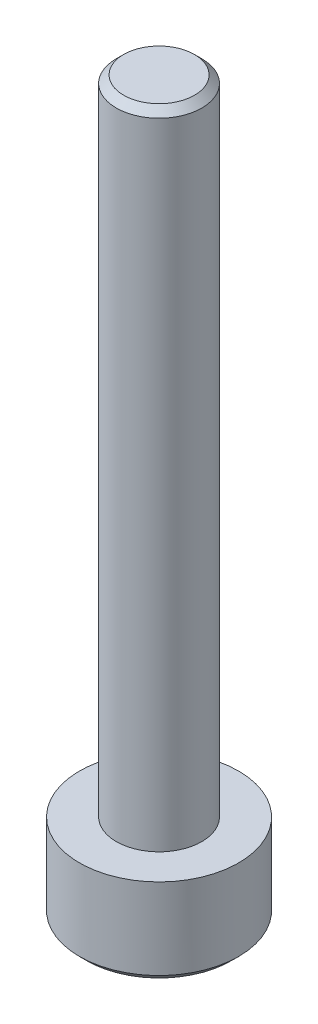
ISO-10303-21;
HEADER;
FILE_DESCRIPTION(('STEP AP214'),'2;1');
FILE_NAME('part.step','',(''),(''),'','','');
FILE_SCHEMA(('AUTOMOTIVE_DESIGN { 1 0 10303 214 1 1 1 1 }'));
ENDSEC;
DATA;
#1=APPLICATION_CONTEXT('core data for automotive mechanical design processes');
#2=APPLICATION_PROTOCOL_DEFINITION('international standard','automotive_design',2000,#1);
#3=PRODUCT_CONTEXT('',#1,'mechanical');
#4=PRODUCT('Part','Part','',(#3));
#5=PRODUCT_RELATED_PRODUCT_CATEGORY('part','',(#4));
#6=PRODUCT_DEFINITION_FORMATION('','',#4);
#7=PRODUCT_DEFINITION_CONTEXT('part definition',#1,'design');
#8=PRODUCT_DEFINITION('design','',#6,#7);
#9=PRODUCT_DEFINITION_SHAPE('','',#8);
#10=(LENGTH_UNIT() NAMED_UNIT(*) SI_UNIT(.MILLI.,.METRE.));
#11=(NAMED_UNIT(*) PLANE_ANGLE_UNIT() SI_UNIT($,.RADIAN.));
#12=(NAMED_UNIT(*) SI_UNIT($,.STERADIAN.) SOLID_ANGLE_UNIT());
#13=UNCERTAINTY_MEASURE_WITH_UNIT(LENGTH_MEASURE(1.E-05),#10,'distance_accuracy_value','');
#14=(GEOMETRIC_REPRESENTATION_CONTEXT(3) GLOBAL_UNCERTAINTY_ASSIGNED_CONTEXT((#13)) GLOBAL_UNIT_ASSIGNED_CONTEXT((#10,
#11,#12)) REPRESENTATION_CONTEXT('',''));
#15=CARTESIAN_POINT('',(0.,0.,0.));
#16=DIRECTION('',(0.,0.,1.));
#17=DIRECTION('',(1.,0.,0.));
#18=AXIS2_PLACEMENT_3D('',#15,#16,#17);
#19=CARTESIAN_POINT('',(-15.5228000000053,-18.3500000000003,36.5660001071556));
#20=DIRECTION('',(0.,1.,0.));
#21=DIRECTION('',(0.,0.,1.));
#22=AXIS2_PLACEMENT_3D('',#19,#20,#21);
#23=PLANE('',#22);
#24=CARTESIAN_POINT('',(-15.5228000000053,-18.3499999999642,36.5660001071556));
#25=DIRECTION('',(0.,-1.,0.));
#26=DIRECTION('',(0.,0.,-1.));
#27=AXIS2_PLACEMENT_3D('',#24,#25,#26);
#28=CIRCLE('',#27,1.24999999998276);
#29=CARTESIAN_POINT('',(-16.147800000001,-18.3499999999822,37.6485318618787));
#30=VERTEX_POINT('',#29);
#31=CARTESIAN_POINT('',(-14.8978000000096,-18.3499999999822,37.6485318618787));
#32=VERTEX_POINT('',#31);
#33=EDGE_CURVE('E285',#30,#32,#28,.F.);
#34=ORIENTED_EDGE('',*,*,#33,.T.);
#35=DIRECTION('',(0.866025403784438,0.,-0.5));
#36=VECTOR('',#35,1.);
#37=CARTESIAN_POINT('',(-15.5228000000053,-18.3500000000003,38.0093757801296));
#38=LINE('',#37,#36);
#39=CARTESIAN_POINT('',(-15.5228000000053,-18.3500000000003,38.0093757801296));
#40=VERTEX_POINT('',#39);
#41=EDGE_CURVE('E190',#32,#40,#38,.F.);
#42=ORIENTED_EDGE('',*,*,#41,.T.);
#43=DIRECTION('',(0.866025403784438,0.,0.5));
#44=VECTOR('',#43,1.);
#45=CARTESIAN_POINT('',(-16.7728000000053,-18.3500000000003,37.2876879436426));
#46=LINE('',#45,#44);
#47=EDGE_CURVE('E179',#40,#30,#46,.F.);
#48=ORIENTED_EDGE('',*,*,#47,.T.);
#49=EDGE_LOOP('',(#34,#42,#48));
#50=FACE_BOUND('',#49,.T.);
#51=ADVANCED_FACE('F16',(#50),#23,.F.);
#52=CARTESIAN_POINT('',(-15.5228000000053,-18.3500000000003,36.5660001071556));
#53=DIRECTION('',(0.,1.,0.));
#54=DIRECTION('',(0.,0.,1.));
#55=AXIS2_PLACEMENT_3D('',#52,#53,#54);
#56=PLANE('',#55);
#57=DIRECTION('',(0.,0.,-1.));
#58=VECTOR('',#57,1.);
#59=CARTESIAN_POINT('',(-14.2728000000053,-18.3500000000003,37.2876879436426));
#60=LINE('',#59,#58);
#61=CARTESIAN_POINT('',(-14.2728000000139,-18.3499999999822,36.5660001071556));
#62=VERTEX_POINT('',#61);
#63=CARTESIAN_POINT('',(-14.2728000000053,-18.3500000000003,37.2876879436426));
#64=VERTEX_POINT('',#63);
#65=EDGE_CURVE('E86',#62,#64,#60,.F.);
#66=ORIENTED_EDGE('',*,*,#65,.T.);
#67=DIRECTION('',(0.866025403784438,0.,-0.5));
#68=VECTOR('',#67,1.);
#69=CARTESIAN_POINT('',(-15.5228000000053,-18.3500000000003,38.0093757801296));
#70=LINE('',#69,#68);
#71=EDGE_CURVE('E188',#64,#32,#70,.F.);
#72=ORIENTED_EDGE('',*,*,#71,.T.);
#73=CARTESIAN_POINT('',(-15.5228000000053,-18.3499999999642,36.5660001071556));
#74=DIRECTION('',(0.,-1.,0.));
#75=DIRECTION('',(0.,0.,-1.));
#76=AXIS2_PLACEMENT_3D('',#73,#74,#75);
#77=CIRCLE('',#76,1.24999999998276);
#78=EDGE_CURVE('E287',#32,#62,#77,.F.);
#79=ORIENTED_EDGE('',*,*,#78,.T.);
#80=EDGE_LOOP('',(#66,#72,#79));
#81=FACE_BOUND('',#80,.T.);
#82=ADVANCED_FACE('F295',(#81),#56,.F.);
#83=CARTESIAN_POINT('',(-15.5228000000053,-20.2500000000003,38.0093757801296));
#84=DIRECTION('',(0.5,0.,0.866025403784438));
#85=DIRECTION('',(0.866025403784438,0.,-0.5));
#86=AXIS2_PLACEMENT_3D('',#83,#84,#85);
#87=PLANE('',#86);
#88=CARTESIAN_POINT('',(-15.5227999999972,-20.193375672993,38.0093757801249));
#89=CARTESIAN_POINT('',(-15.4801175563752,-20.1687559461718,37.9847330598101));
#90=CARTESIAN_POINT('',(-15.4367260098119,-20.1455737686743,37.9596809387212));
#91=CARTESIAN_POINT('',(-15.3482297913351,-20.1030803690877,37.9085876231614));
#92=CARTESIAN_POINT('',(-15.3031159179826,-20.0837949237996,37.8825411162371));
#93=CARTESIAN_POINT('',(-15.2115843030825,-20.0504931047224,37.8296953137352));
#94=CARTESIAN_POINT('',(-15.1651715602253,-20.0364588987216,37.8028989041527));
#95=CARTESIAN_POINT('',(-15.0713286285284,-20.0148526318887,37.748718662276));
#96=CARTESIAN_POINT('',(-15.0239020572991,-20.0072605878351,37.72133691861));
#97=CARTESIAN_POINT('',(-14.9632188888939,-20.0021889660016,37.686301474996));
#98=CARTESIAN_POINT('',(-14.9501416722315,-20.0013690434408,37.6787513404357));
#99=CARTESIAN_POINT('',(-14.9239769145469,-20.000274461217,37.6636451105432));
#100=CARTESIAN_POINT('',(-14.9108893830032,-19.9999995053513,37.6560890206834));
#101=CARTESIAN_POINT('',(-14.8649482213952,-20.000001241554,37.6295648786622));
#102=CARTESIAN_POINT('',(-14.8320847802657,-20.0017375772482,37.6105911620796));
#103=CARTESIAN_POINT('',(-14.7666142149239,-20.0085797997671,37.5727917135555));
#104=CARTESIAN_POINT('',(-14.7340072855495,-20.0136880367729,37.5539660941037));
#105=CARTESIAN_POINT('',(-14.6366210568422,-20.0337512506109,37.4977401287442));
#106=CARTESIAN_POINT('',(-14.5725515012742,-20.0534413272366,37.4607495535902));
#107=CARTESIAN_POINT('',(-14.4690579695075,-20.0937221523114,37.4009975351653));
#108=CARTESIAN_POINT('',(-14.4287908582222,-20.1116336746869,37.3777493076252));
#109=CARTESIAN_POINT('',(-14.3497813310795,-20.1504537227757,37.3321331358608));
#110=CARTESIAN_POINT('',(-14.311028338268,-20.1713333378975,37.3097590850292));
#111=CARTESIAN_POINT('',(-14.2728000000134,-20.1933756729931,37.2876879436472));
#112=B_SPLINE_CURVE_WITH_KNOTS('',3,(#88,#89,#90,#91,#92,#93,#94,#95,#96,#97,#98,#99,#100,#101,
#102,#103,#104,#105,#106,#107,#108,#109,#110,#111),.UNSPECIFIED.,.F.,.F.,(4,2,2,2,2,2,2,2,2,2,2,
4),(0.,0.165391499317371,0.331843613074453,0.497725243643207,0.663090417925458,
0.708451144395426,0.753787209426764,0.867571821864671,0.981435824887579,1.21010447291918,
1.35949058319742,1.50751033117175),.UNSPECIFIED.);
#113=CARTESIAN_POINT('',(-15.5228000000053,-20.193375672993,38.009375780125));
#114=VERTEX_POINT('',#113);
#115=CARTESIAN_POINT('',(-14.2728000000093,-20.1933756729954,37.2876879436449));
#116=VERTEX_POINT('',#115);
#117=EDGE_CURVE('E19',#114,#116,#112,.T.);
#118=ORIENTED_EDGE('',*,*,#117,.F.);
#119=DIRECTION('',(0.,1.,0.));
#120=VECTOR('',#119,1.);
#121=CARTESIAN_POINT('',(-15.5228000000053,-20.2500000000003,38.0093757801296));
#122=LINE('',#121,#120);
#123=EDGE_CURVE('E182',#114,#40,#122,.T.);
#124=ORIENTED_EDGE('',*,*,#123,.T.);
#125=ORIENTED_EDGE('',*,*,#41,.F.);
#126=ORIENTED_EDGE('',*,*,#71,.F.);
#127=DIRECTION('',(0.,1.,0.));
#128=VECTOR('',#127,1.);
#129=CARTESIAN_POINT('',(-14.2728000000053,-20.2500000000003,37.2876879436426));
#130=LINE('',#129,#128);
#131=EDGE_CURVE('E157',#64,#116,#130,.F.);
#132=ORIENTED_EDGE('',*,*,#131,.T.);
#133=EDGE_LOOP('',(#118,#124,#125,#126,#132));
#134=FACE_BOUND('',#133,.T.);
#135=ADVANCED_FACE('F275',(#134),#87,.F.);
#136=CARTESIAN_POINT('',(-16.7728000000053,-20.2500000000003,37.2876879436426));
#137=DIRECTION('',(-0.5,0.,0.866025403784438));
#138=DIRECTION('',(0.866025403784438,0.,0.5));
#139=AXIS2_PLACEMENT_3D('',#136,#137,#138);
#140=PLANE('',#139);
#141=ORIENTED_EDGE('',*,*,#123,.F.);
#142=CARTESIAN_POINT('',(-16.7727999999972,-20.1933756729931,37.2876879436473));
#143=CARTESIAN_POINT('',(-16.7301175563751,-20.1687559461718,37.3123306639622));
#144=CARTESIAN_POINT('',(-16.6867260098118,-20.1455737686743,37.337382785051));
#145=CARTESIAN_POINT('',(-16.5982297913351,-20.1030803690877,37.3884761006108));
#146=CARTESIAN_POINT('',(-16.5531159179826,-20.0837949237996,37.4145226075351));
#147=CARTESIAN_POINT('',(-16.4615843030825,-20.0504931047225,37.467368410037));
#148=CARTESIAN_POINT('',(-16.4151715602252,-20.0364588987216,37.4941648196195));
#149=CARTESIAN_POINT('',(-16.3213286285283,-20.0148526318888,37.5483450614962));
#150=CARTESIAN_POINT('',(-16.273902057299,-20.0072605878352,37.5757268051622));
#151=CARTESIAN_POINT('',(-16.2132188888938,-20.0021889660017,37.6107622487762));
#152=CARTESIAN_POINT('',(-16.2001416722314,-20.0013690434408,37.6183123833365));
#153=CARTESIAN_POINT('',(-16.1739769145469,-20.000274461217,37.633418613229));
#154=CARTESIAN_POINT('',(-16.1608893830032,-19.9999995053513,37.6409747030888));
#155=CARTESIAN_POINT('',(-16.1149482213952,-20.000001241554,37.66749884511));
#156=CARTESIAN_POINT('',(-16.0820847802657,-20.0017375772483,37.6864725616926));
#157=CARTESIAN_POINT('',(-16.0166142149239,-20.0085797997671,37.7242720102167));
#158=CARTESIAN_POINT('',(-15.9840072855495,-20.0136880367729,37.7430976296685));
#159=CARTESIAN_POINT('',(-15.8866210568422,-20.0337512506109,37.799323595028));
#160=CARTESIAN_POINT('',(-15.8225515012742,-20.0534413272366,37.836314170182));
#161=CARTESIAN_POINT('',(-15.7190579695075,-20.0937221523114,37.8960661886069));
#162=CARTESIAN_POINT('',(-15.6787908582222,-20.1116336746869,37.919314416147));
#163=CARTESIAN_POINT('',(-15.5997813310795,-20.1504537227757,37.9649305879114));
#164=CARTESIAN_POINT('',(-15.561028338268,-20.1713333378975,37.987304638743));
#165=CARTESIAN_POINT('',(-15.5228000000134,-20.1933756729931,38.009375780125));
#166=B_SPLINE_CURVE_WITH_KNOTS('',3,(#142,#143,#144,#145,#146,#147,#148,#149,#150,#151,#152,
#153,#154,#155,#156,#157,#158,#159,#160,#161,#162,#163,#164,#165),.UNSPECIFIED.,.F.,.F.,(4,2,2,
2,2,2,2,2,2,2,2,4),(0.,0.165391499317376,0.331843613074476,0.497725243643234,0.663090417925483,
0.708451144395425,0.753787209426728,0.86757182186464,0.98143582488755,1.21010447291914,
1.35949058319738,1.50751033117172),.UNSPECIFIED.);
#167=CARTESIAN_POINT('',(-16.7728000000013,-20.1933756729931,37.2876879436403));
#168=VERTEX_POINT('',#167);
#169=EDGE_CURVE('E185',#168,#114,#166,.T.);
#170=ORIENTED_EDGE('',*,*,#169,.F.);
#171=DIRECTION('',(0.,1.,0.));
#172=VECTOR('',#171,1.);
#173=CARTESIAN_POINT('',(-16.7728000000053,-20.2500000000003,37.2876879436426));
#174=LINE('',#173,#172);
#175=CARTESIAN_POINT('',(-16.7728000000053,-18.3500000000003,37.2876879436426));
#176=VERTEX_POINT('',#175);
#177=EDGE_CURVE('E153',#168,#176,#174,.T.);
#178=ORIENTED_EDGE('',*,*,#177,.T.);
#179=DIRECTION('',(0.866025403784452,0.,0.499999999999977));
#180=VECTOR('',#179,1.);
#181=CARTESIAN_POINT('',(-16.7728000000053,-18.3500000000003,37.2876879436426));
#182=LINE('',#181,#180);
#183=EDGE_CURVE('E176',#176,#30,#182,.T.);
#184=ORIENTED_EDGE('',*,*,#183,.T.);
#185=ORIENTED_EDGE('',*,*,#47,.F.);
#186=EDGE_LOOP('',(#141,#170,#178,#184,#185));
#187=FACE_BOUND('',#186,.T.);
#188=ADVANCED_FACE('F271',(#187),#140,.F.);
#189=CARTESIAN_POINT('',(-15.5228000000053,-18.3500000000003,36.5660001071556));
#190=DIRECTION('',(0.,1.,0.));
#191=DIRECTION('',(0.,0.,1.));
#192=AXIS2_PLACEMENT_3D('',#189,#190,#191);
#193=PLANE('',#192);
#194=ORIENTED_EDGE('',*,*,#183,.F.);
#195=DIRECTION('',(0.,0.,1.));
#196=VECTOR('',#195,1.);
#197=CARTESIAN_POINT('',(-16.7728000000053,-18.3500000000003,35.8443122706685));
#198=LINE('',#197,#196);
#199=CARTESIAN_POINT('',(-16.7727999999967,-18.3499999999822,36.5660001071556));
#200=VERTEX_POINT('',#199);
#201=EDGE_CURVE('E150',#176,#200,#198,.F.);
#202=ORIENTED_EDGE('',*,*,#201,.T.);
#203=CARTESIAN_POINT('',(-15.5228000000053,-18.3499999999642,36.5660001071556));
#204=DIRECTION('',(0.,-1.,0.));
#205=DIRECTION('',(0.,0.,-1.));
#206=AXIS2_PLACEMENT_3D('',#203,#204,#205);
#207=CIRCLE('',#206,1.24999999998276);
#208=EDGE_CURVE('E116',#200,#30,#207,.F.);
#209=ORIENTED_EDGE('',*,*,#208,.T.);
#210=EDGE_LOOP('',(#194,#202,#209));
#211=FACE_BOUND('',#210,.T.);
#212=ADVANCED_FACE('F268',(#211),#193,.F.);
#213=CARTESIAN_POINT('',(-15.5228000000053,-18.3499999998276,36.5660001071556));
#214=DIRECTION('',(0.,-1.,0.));
#215=DIRECTION('',(0.,0.,-1.));
#216=AXIS2_PLACEMENT_3D('',#213,#214,#215);
#217=CONICAL_SURFACE('',#216,1.24999999975539,1.0297442584364);
#218=ORIENTED_EDGE('',*,*,#33,.F.);
#219=ORIENTED_EDGE('',*,*,#208,.F.);
#220=CARTESIAN_POINT('',(-15.5228000000053,-18.3499999999642,36.5660001071556));
#221=DIRECTION('',(0.,-1.,0.));
#222=DIRECTION('',(0.,0.,-1.));
#223=AXIS2_PLACEMENT_3D('',#220,#221,#222);
#224=CIRCLE('',#223,1.24999999998276);
#225=CARTESIAN_POINT('',(-16.147800000001,-18.3499999999822,35.4834683524325));
#226=VERTEX_POINT('',#225);
#227=EDGE_CURVE('E109',#200,#226,#224,.T.);
#228=ORIENTED_EDGE('',*,*,#227,.T.);
#229=CARTESIAN_POINT('',(-15.5228000000053,-18.3499999999642,36.5660001071556));
#230=DIRECTION('',(0.,-1.,0.));
#231=DIRECTION('',(0.,0.,-1.));
#232=AXIS2_PLACEMENT_3D('',#229,#230,#231);
#233=CIRCLE('',#232,1.24999999998276);
#234=CARTESIAN_POINT('',(-14.8978000000096,-18.3499999999822,35.4834683524325));
#235=VERTEX_POINT('',#234);
#236=EDGE_CURVE('E114',#226,#235,#233,.T.);
#237=ORIENTED_EDGE('',*,*,#236,.T.);
#238=CARTESIAN_POINT('',(-15.5228000000053,-18.3499999999642,36.5660001071556));
#239=DIRECTION('',(0.,-1.,0.));
#240=DIRECTION('',(0.,0.,-1.));
#241=AXIS2_PLACEMENT_3D('',#238,#239,#240);
#242=CIRCLE('',#241,1.24999999998276);
#243=EDGE_CURVE('E165',#235,#62,#242,.T.);
#244=ORIENTED_EDGE('',*,*,#243,.T.);
#245=ORIENTED_EDGE('',*,*,#78,.F.);
#246=EDGE_LOOP('',(#218,#219,#228,#237,#244,#245));
#247=FACE_BOUND('',#246,.T.);
#248=CARTESIAN_POINT('',(-15.5228000000053,-17.5989242259789,36.5660001068022));
#249=VERTEX_POINT('',#248);
#250=VERTEX_LOOP('',#249);
#251=FACE_BOUND('',#250,.T.);
#252=ADVANCED_FACE('F111',(#247,#251),#217,.F.);
#253=CARTESIAN_POINT('',(-15.5228000000053,-18.3500000000003,36.5660001071556));
#254=DIRECTION('',(0.,1.,0.));
#255=DIRECTION('',(0.,0.,1.));
#256=AXIS2_PLACEMENT_3D('',#253,#254,#255);
#257=PLANE('',#256);
#258=DIRECTION('',(-0.866025403784438,0.,-0.5));
#259=VECTOR('',#258,1.);
#260=CARTESIAN_POINT('',(-14.2728000000053,-18.3500000000003,35.8443122706685));
#261=LINE('',#260,#259);
#262=CARTESIAN_POINT('',(-14.2728000000053,-18.3500000000003,35.8443122706685));
#263=VERTEX_POINT('',#262);
#264=EDGE_CURVE('E168',#235,#263,#261,.F.);
#265=ORIENTED_EDGE('',*,*,#264,.T.);
#266=DIRECTION('',(0.,0.,-1.));
#267=VECTOR('',#266,1.);
#268=CARTESIAN_POINT('',(-14.2728000000053,-18.3500000000003,37.2876879436426));
#269=LINE('',#268,#267);
#270=EDGE_CURVE('E162',#263,#62,#269,.F.);
#271=ORIENTED_EDGE('',*,*,#270,.T.);
#272=ORIENTED_EDGE('',*,*,#243,.F.);
#273=EDGE_LOOP('',(#265,#271,#272));
#274=FACE_BOUND('',#273,.T.);
#275=ADVANCED_FACE('F260',(#274),#257,.F.);
#276=CARTESIAN_POINT('',(-14.2728000000053,-20.2500000000003,37.2876879436426));
#277=DIRECTION('',(1.,0.,0.));
#278=DIRECTION('',(0.,0.,-1.));
#279=AXIS2_PLACEMENT_3D('',#276,#277,#278);
#280=PLANE('',#279);
#281=CARTESIAN_POINT('',(-14.2728000000053,-20.1933756729931,37.2876879436333));
#282=CARTESIAN_POINT('',(-14.2728000000053,-20.1687559461718,37.2384025030035));
#283=CARTESIAN_POINT('',(-14.2728000000053,-20.1455737686743,37.1882982608258));
#284=CARTESIAN_POINT('',(-14.2728000000053,-20.1030803690877,37.0861116297061));
#285=CARTESIAN_POINT('',(-14.2728000000053,-20.0837949237996,37.0340186158577));
#286=CARTESIAN_POINT('',(-14.2728000000053,-20.0504931047225,36.9283270108537));
#287=CARTESIAN_POINT('',(-14.2728000000053,-20.0364588987216,36.8747341916889));
#288=CARTESIAN_POINT('',(-14.2728000000053,-20.0148526318888,36.7663737079354));
#289=CARTESIAN_POINT('',(-14.2728000000053,-20.0072605878352,36.7116102206034));
#290=CARTESIAN_POINT('',(-14.2728000000053,-20.0021889660017,36.6415393333754));
#291=CARTESIAN_POINT('',(-14.2728000000053,-20.0013690434408,36.6264390642548));
#292=CARTESIAN_POINT('',(-14.2728000000053,-20.000274461217,36.5962266044699));
#293=CARTESIAN_POINT('',(-14.2728000000053,-19.9999995053514,36.5811144247503));
#294=CARTESIAN_POINT('',(-14.2728000000053,-20.000001241554,36.5280661407078));
#295=CARTESIAN_POINT('',(-14.2728000000053,-20.0017375772483,36.4901187075426));
#296=CARTESIAN_POINT('',(-14.2728000000053,-20.0085797997672,36.4145198104944));
#297=CARTESIAN_POINT('',(-14.2728000000053,-20.013688036773,36.3768685715909));
#298=CARTESIAN_POINT('',(-14.2728000000053,-20.0337512506109,36.2644166408718));
#299=CARTESIAN_POINT('',(-14.2728000000053,-20.0534413272367,36.1904354905637));
#300=CARTESIAN_POINT('',(-14.2728000000053,-20.0937221523115,36.0709314537139));
#301=CARTESIAN_POINT('',(-14.2728000000053,-20.111633674687,36.0244349986339));
#302=CARTESIAN_POINT('',(-14.2728000000053,-20.1504537227757,35.933202655105));
#303=CARTESIAN_POINT('',(-14.2728000000053,-20.1713333378976,35.8884545534418));
#304=CARTESIAN_POINT('',(-14.2728000000053,-20.1933756729931,35.8443122706779));
#305=B_SPLINE_CURVE_WITH_KNOTS('',3,(#281,#282,#283,#284,#285,#286,#287,#288,#289,#290,#291,
#292,#293,#294,#295,#296,#297,#298,#299,#300,#301,#302,#303,#304),.UNSPECIFIED.,.F.,.F.,(4,2,2,
2,2,2,2,2,2,2,2,4),(0.,0.165391499317367,0.331843613074439,0.49772524364318,0.66309041792541,
0.708451144395361,0.753787209426684,0.867571821864597,0.981435824887513,1.21010447291912,
1.35949058319737,1.50751033117172),.UNSPECIFIED.);
#306=CARTESIAN_POINT('',(-14.2728000000053,-20.1933756729955,35.8443122706732));
#307=VERTEX_POINT('',#306);
#308=EDGE_CURVE('E80',#116,#307,#305,.T.);
#309=ORIENTED_EDGE('',*,*,#308,.F.);
#310=ORIENTED_EDGE('',*,*,#131,.F.);
#311=ORIENTED_EDGE('',*,*,#65,.F.);
#312=ORIENTED_EDGE('',*,*,#270,.F.);
#313=DIRECTION('',(0.,1.,0.));
#314=VECTOR('',#313,1.);
#315=CARTESIAN_POINT('',(-14.2728000000053,-20.2500000000003,35.8443122706685));
#316=LINE('',#315,#314);
#317=EDGE_CURVE('E170',#263,#307,#316,.F.);
#318=ORIENTED_EDGE('',*,*,#317,.T.);
#319=EDGE_LOOP('',(#309,#310,#311,#312,#318));
#320=FACE_BOUND('',#319,.T.);
#321=ADVANCED_FACE('F255',(#320),#280,.F.);
#322=CARTESIAN_POINT('',(-16.7728000000053,-20.2500000000003,35.8443122706685));
#323=DIRECTION('',(-1.,0.,0.));
#324=DIRECTION('',(0.,0.,1.));
#325=AXIS2_PLACEMENT_3D('',#322,#323,#324);
#326=PLANE('',#325);
#327=ORIENTED_EDGE('',*,*,#177,.F.);
#328=CARTESIAN_POINT('',(-16.7728000000053,-20.1933756715777,35.8443122735088));
#329=CARTESIAN_POINT('',(-16.7728000000053,-20.1687559449108,35.8935977139733));
#330=CARTESIAN_POINT('',(-16.7728000000053,-20.1455737675654,35.9437019559814));
#331=CARTESIAN_POINT('',(-16.7728000000053,-20.1030803682698,36.0458885867454));
#332=CARTESIAN_POINT('',(-16.7728000000053,-20.0837949231201,36.0979816004077));
#333=CARTESIAN_POINT('',(-16.7728000000053,-20.0504931042925,36.203673205023));
#334=CARTESIAN_POINT('',(-16.7728000000053,-20.0364588984027,36.2572660239855));
#335=CARTESIAN_POINT('',(-16.7728000000053,-20.0148526317471,36.3656265073211));
#336=CARTESIAN_POINT('',(-16.7728000000053,-20.0072605877601,36.4203899944376));
#337=CARTESIAN_POINT('',(-16.7728000000053,-20.002188965977,36.4904608813621));
#338=CARTESIAN_POINT('',(-16.7728000000053,-20.0013690434254,36.5055611503976));
#339=CARTESIAN_POINT('',(-16.7728000000053,-20.0002744612139,36.535773610012));
#340=CARTESIAN_POINT('',(-16.7728000000053,-19.9999995053514,36.5508857896463));
#341=CARTESIAN_POINT('',(-16.7728000000053,-20.000001241554,36.6039340736033));
#342=CARTESIAN_POINT('',(-16.7728000000053,-20.0017375772483,36.6418815067686));
#343=CARTESIAN_POINT('',(-16.7728000000053,-20.0085797997672,36.7174804038168));
#344=CARTESIAN_POINT('',(-16.7728000000053,-20.013688036773,36.7551316427204));
#345=CARTESIAN_POINT('',(-16.7728000000053,-20.033751250611,36.8675835734394));
#346=CARTESIAN_POINT('',(-16.7728000000053,-20.0534413272367,36.9415647237475));
#347=CARTESIAN_POINT('',(-16.7728000000053,-20.0937221523115,37.0610687605973));
#348=CARTESIAN_POINT('',(-16.7728000000053,-20.111633674687,37.1075652156773));
#349=CARTESIAN_POINT('',(-16.7728000000053,-20.1504537227757,37.1987975592061));
#350=CARTESIAN_POINT('',(-16.7728000000053,-20.1713333378976,37.2435456608693));
#351=CARTESIAN_POINT('',(-16.7728000000053,-20.1933756729931,37.2876879436333));
#352=B_SPLINE_CURVE_WITH_KNOTS('',3,(#328,#329,#330,#331,#332,#333,#334,#335,#336,#337,#338,
#339,#340,#341,#342,#343,#344,#345,#346,#347,#348,#349,#350,#351),.UNSPECIFIED.,.F.,.F.,(4,2,2,
2,2,2,2,2,2,2,2,4),(0.,0.165391498665354,0.331843611755447,0.497725241655209,0.663090415275238,
0.708451141488781,0.753787206264148,0.867571818702068,0.981435821725076,1.21010446975658,
1.35949058003477,1.50751032800909),.UNSPECIFIED.);
#353=CARTESIAN_POINT('',(-16.7728000000053,-20.1933756722877,35.8443122720887));
#354=VERTEX_POINT('',#353);
#355=EDGE_CURVE('E40',#354,#168,#352,.T.);
#356=ORIENTED_EDGE('',*,*,#355,.F.);
#357=DIRECTION('',(0.,1.,0.));
#358=VECTOR('',#357,1.);
#359=CARTESIAN_POINT('',(-16.7728000000053,-20.2500000000003,35.8443122706685));
#360=LINE('',#359,#358);
#361=CARTESIAN_POINT('',(-16.7728000000053,-18.3500000000003,35.8443122706685));
#362=VERTEX_POINT('',#361);
#363=EDGE_CURVE('E127',#354,#362,#360,.T.);
#364=ORIENTED_EDGE('',*,*,#363,.T.);
#365=DIRECTION('',(0.,0.,1.));
#366=VECTOR('',#365,1.);
#367=CARTESIAN_POINT('',(-16.7728000000053,-18.3500000000003,36.5660001071556));
#368=LINE('',#367,#366);
#369=EDGE_CURVE('E119',#362,#200,#368,.T.);
#370=ORIENTED_EDGE('',*,*,#369,.T.);
#371=ORIENTED_EDGE('',*,*,#201,.F.);
#372=EDGE_LOOP('',(#327,#356,#364,#370,#371));
#373=FACE_BOUND('',#372,.T.);
#374=ADVANCED_FACE('F259',(#373),#326,.F.);
#375=CARTESIAN_POINT('',(-15.5228000000053,-18.3500000000003,36.5660001071556));
#376=DIRECTION('',(0.,1.,0.));
#377=DIRECTION('',(0.,0.,1.));
#378=AXIS2_PLACEMENT_3D('',#375,#376,#377);
#379=PLANE('',#378);
#380=ORIENTED_EDGE('',*,*,#369,.F.);
#381=DIRECTION('',(-0.866025403784438,0.,0.5));
#382=VECTOR('',#381,1.);
#383=CARTESIAN_POINT('',(-15.5228000000053,-18.3500000000003,35.1226244341815));
#384=LINE('',#383,#382);
#385=EDGE_CURVE('E122',#362,#226,#384,.F.);
#386=ORIENTED_EDGE('',*,*,#385,.T.);
#387=ORIENTED_EDGE('',*,*,#227,.F.);
#388=EDGE_LOOP('',(#380,#386,#387));
#389=FACE_BOUND('',#388,.T.);
#390=ADVANCED_FACE('F123',(#389),#379,.F.);
#391=CARTESIAN_POINT('',(-15.5228000000053,-18.3500000000003,36.5660001071556));
#392=DIRECTION('',(0.,1.,0.));
#393=DIRECTION('',(0.,0.,1.));
#394=AXIS2_PLACEMENT_3D('',#391,#392,#393);
#395=PLANE('',#394);
#396=DIRECTION('',(-0.866025403784438,0.,0.5));
#397=VECTOR('',#396,1.);
#398=CARTESIAN_POINT('',(-15.5228000000053,-18.3500000000003,35.1226244341815));
#399=LINE('',#398,#397);
#400=CARTESIAN_POINT('',(-15.5228000000053,-18.3500000000003,35.1226244341815));
#401=VERTEX_POINT('',#400);
#402=EDGE_CURVE('E103',#226,#401,#399,.F.);
#403=ORIENTED_EDGE('',*,*,#402,.T.);
#404=DIRECTION('',(-0.866025403784438,0.,-0.5));
#405=VECTOR('',#404,1.);
#406=CARTESIAN_POINT('',(-14.2728000000053,-18.3500000000003,35.8443122706685));
#407=LINE('',#406,#405);
#408=EDGE_CURVE('E130',#401,#235,#407,.F.);
#409=ORIENTED_EDGE('',*,*,#408,.T.);
#410=ORIENTED_EDGE('',*,*,#236,.F.);
#411=EDGE_LOOP('',(#403,#409,#410));
#412=FACE_BOUND('',#411,.T.);
#413=ADVANCED_FACE('F129',(#412),#395,.F.);
#414=CARTESIAN_POINT('',(-14.2728000000053,-20.2500000000003,35.8443122706685));
#415=DIRECTION('',(0.5,0.,-0.866025403784438));
#416=DIRECTION('',(-0.866025403784438,0.,-0.5));
#417=AXIS2_PLACEMENT_3D('',#414,#415,#416);
#418=PLANE('',#417);
#419=CARTESIAN_POINT('',(-14.2728000000134,-20.1933756729931,35.8443122706638));
#420=CARTESIAN_POINT('',(-14.3154824436418,-20.1687559461682,35.8196695503453));
#421=CARTESIAN_POINT('',(-14.3588739902116,-20.1455737686675,35.7946174292527));
#422=CARTESIAN_POINT('',(-14.4473702087018,-20.1030803690759,35.7435241136851));
#423=CARTESIAN_POINT('',(-14.4924840820613,-20.0837949237859,35.7174776067568));
#424=CARTESIAN_POINT('',(-14.5840156969622,-20.0504931047118,35.6646318042544));
#425=CARTESIAN_POINT('',(-14.6304284398129,-20.0364588987144,35.6378353946757));
#426=CARTESIAN_POINT('',(-14.7242713714962,-20.0148526318866,35.5836551528068));
#427=CARTESIAN_POINT('',(-14.7716979427185,-20.0072605878347,35.5562734091449));
#428=CARTESIAN_POINT('',(-14.8323811111163,-20.0021889660018,35.5212379655351));
#429=CARTESIAN_POINT('',(-14.8454583277782,-20.0013690434409,35.5136878309751));
#430=CARTESIAN_POINT('',(-14.8716230854628,-20.0002744612171,35.4985816010826));
#431=CARTESIAN_POINT('',(-14.884710617007,-19.9999995053514,35.4910255112226));
#432=CARTESIAN_POINT('',(-14.9306517786204,-20.0000012415541,35.4645013691982));
#433=CARTESIAN_POINT('',(-14.9635152197549,-20.0017375772489,35.4455276526127));
#434=CARTESIAN_POINT('',(-15.0289857851066,-20.0085797997698,35.4077282040829));
#435=CARTESIAN_POINT('',(-15.0615927144858,-20.0136880367772,35.3889025846284));
#436=CARTESIAN_POINT('',(-15.1589789431884,-20.0337512506169,35.3326766192715));
#437=CARTESIAN_POINT('',(-15.2230484987484,-20.0534413272398,35.2956860441222));
#438=CARTESIAN_POINT('',(-15.3265420267389,-20.0937221508475,35.2359340278774));
#439=CARTESIAN_POINT('',(-15.3668091343736,-20.1116336713924,35.2126858024451));
#440=CARTESIAN_POINT('',(-15.445818654488,-20.1504537153395,35.1670696347385));
#441=CARTESIAN_POINT('',(-15.4845716439188,-20.1713333281575,35.1446955858587));
#442=CARTESIAN_POINT('',(-15.5227999788845,-20.1933756608037,35.1226244463756));
#443=B_SPLINE_CURVE_WITH_KNOTS('',3,(#419,#420,#421,#422,#423,#424,#425,#426,#427,#428,#429,
#430,#431,#432,#433,#434,#435,#436,#437,#438,#439,#440,#441,#442),.UNSPECIFIED.,.F.,.F.,(4,2,2,
2,2,2,2,2,2,2,2,4),(0.,0.165391499341779,0.331843613123341,0.497725243667557,0.663090417925434,
0.708451144393822,0.753787209426734,0.867571821881892,0.981435824922463,1.21010447291927,
1.35949056945268,1.50751030392988),.UNSPECIFIED.);
#444=CARTESIAN_POINT('',(-15.5228000000053,-20.1933756611936,35.1226244459857));
#445=VERTEX_POINT('',#444);
#446=EDGE_CURVE('E222',#307,#445,#443,.T.);
#447=ORIENTED_EDGE('',*,*,#446,.F.);
#448=ORIENTED_EDGE('',*,*,#317,.F.);
#449=ORIENTED_EDGE('',*,*,#264,.F.);
#450=ORIENTED_EDGE('',*,*,#408,.F.);
#451=DIRECTION('',(0.,1.,0.));
#452=VECTOR('',#451,1.);
#453=CARTESIAN_POINT('',(-15.5228000000053,-20.2500000000003,35.1226244341815));
#454=LINE('',#453,#452);
#455=EDGE_CURVE('E137',#401,#445,#454,.F.);
#456=ORIENTED_EDGE('',*,*,#455,.T.);
#457=EDGE_LOOP('',(#447,#448,#449,#450,#456));
#458=FACE_BOUND('',#457,.T.);
#459=ADVANCED_FACE('F355',(#458),#418,.F.);
#460=CARTESIAN_POINT('',(-15.5228000000053,-20.2500000000003,35.1226244341815));
#461=DIRECTION('',(-0.5,0.,-0.866025403784438));
#462=DIRECTION('',(-0.866025403784438,0.,0.5));
#463=AXIS2_PLACEMENT_3D('',#460,#461,#462);
#464=PLANE('',#463);
#465=CARTESIAN_POINT('',(-16.7728000122493,-20.1933756800651,35.8443122777351));
#466=CARTESIAN_POINT('',(-16.7301175679047,-20.1687559524691,35.8196695570047));
#467=CARTESIAN_POINT('',(-16.6867260206003,-20.1455737742087,35.7946174354886));
#468=CARTESIAN_POINT('',(-16.5982298005707,-20.1030803731634,35.7435241190327));
#469=CARTESIAN_POINT('',(-16.5531159264056,-20.0837949271812,35.7174776116391));
#470=CARTESIAN_POINT('',(-16.461584309823,-20.05049310686,35.6646318081657));
#471=CARTESIAN_POINT('',(-16.4151715660963,-20.0364589003079,35.6378353980813));
#472=CARTESIAN_POINT('',(-16.3213286326041,-20.0148526325945,35.5836551551681));
#473=CARTESIAN_POINT('',(-16.2739020604493,-20.00726058821,35.5562734109677));
#474=CARTESIAN_POINT('',(-16.2132188907382,-20.0021889661251,35.5212379665997));
#475=CARTESIAN_POINT('',(-16.200141673708,-20.0013690435181,35.5136878318271));
#476=CARTESIAN_POINT('',(-16.1739769152861,-20.0002744612326,35.4985816015089));
#477=CARTESIAN_POINT('',(-16.1608893833728,-19.9999995053514,35.4910255114358));
#478=CARTESIAN_POINT('',(-16.1149482213901,-20.0000012415541,35.4645013691982));
#479=CARTESIAN_POINT('',(-16.0820847802557,-20.0017375772488,35.4455276526127));
#480=CARTESIAN_POINT('',(-16.0166142149042,-20.0085797997698,35.4077282040831));
#481=CARTESIAN_POINT('',(-15.9840072855251,-20.0136880367772,35.3889025846286));
#482=CARTESIAN_POINT('',(-15.8866210568224,-20.0337512506168,35.3326766192717));
#483=CARTESIAN_POINT('',(-15.8225515012624,-20.0534413272397,35.2956860441223));
#484=CARTESIAN_POINT('',(-15.7190579732717,-20.0937221508475,35.2359340278775));
#485=CARTESIAN_POINT('',(-15.6787908656369,-20.1116336713923,35.2126858024451));
#486=CARTESIAN_POINT('',(-15.5997813455225,-20.1504537153395,35.1670696347385));
#487=CARTESIAN_POINT('',(-15.5610283560917,-20.1713333281575,35.1446955858587));
#488=CARTESIAN_POINT('',(-15.5228000211261,-20.1933756608037,35.1226244463756));
#489=B_SPLINE_CURVE_WITH_KNOTS('',3,(#465,#466,#467,#468,#469,#470,#471,#472,#473,#474,#475,
#476,#477,#478,#479,#480,#481,#482,#483,#484,#485,#486,#487,#488),.UNSPECIFIED.,.F.,.F.,(4,2,2,
2,2,2,2,2,2,2,2,4),(0.,0.165391502600136,0.331843619714929,0.497725253602437,0.663090431169706,
0.708451158918775,0.75378722523015,0.867571837685272,0.981435840725377,1.21010448872267,
1.35949058525618,1.50751031973331),.UNSPECIFIED.);
#490=EDGE_CURVE('E139',#354,#445,#489,.T.);
#491=ORIENTED_EDGE('',*,*,#490,.T.);
#492=ORIENTED_EDGE('',*,*,#455,.F.);
#493=ORIENTED_EDGE('',*,*,#402,.F.);
#494=ORIENTED_EDGE('',*,*,#385,.F.);
#495=ORIENTED_EDGE('',*,*,#363,.F.);
#496=EDGE_LOOP('',(#491,#492,#493,#494,#495));
#497=FACE_BOUND('',#496,.T.);
#498=ADVANCED_FACE('F135',(#497),#464,.F.);
#499=CARTESIAN_POINT('',(-15.5228000000053,-20.2499999999191,36.5660001071556));
#500=DIRECTION('',(0.,-1.,0.));
#501=DIRECTION('',(0.,0.,-1.));
#502=AXIS2_PLACEMENT_3D('',#499,#500,#501);
#503=CONICAL_SURFACE('',#502,1.49999999989536,0.785398163397448);
#504=ORIENTED_EDGE('',*,*,#446,.T.);
#505=ORIENTED_EDGE('',*,*,#490,.F.);
#506=ORIENTED_EDGE('',*,*,#355,.T.);
#507=ORIENTED_EDGE('',*,*,#169,.T.);
#508=ORIENTED_EDGE('',*,*,#117,.T.);
#509=ORIENTED_EDGE('',*,*,#308,.T.);
#510=EDGE_LOOP('',(#504,#505,#506,#507,#508,#509));
#511=FACE_BOUND('',#510,.T.);
#512=CARTESIAN_POINT('',(-15.5228000000053,-20.2500000000451,36.5660001071556));
#513=DIRECTION('',(0.,-1.,0.));
#514=DIRECTION('',(0.,0.,-1.));
#515=AXIS2_PLACEMENT_3D('',#512,#513,#514);
#516=CIRCLE('',#515,1.50000000002137);
#517=CARTESIAN_POINT('',(-15.5228000000053,-20.2500000000451,35.0660001071342));
#518=VERTEX_POINT('',#517);
#519=EDGE_CURVE('E213',#518,#518,#516,.F.);
#520=ORIENTED_EDGE('',*,*,#519,.F.);
#521=EDGE_LOOP('',(#520));
#522=FACE_BOUND('',#521,.T.);
#523=ADVANCED_FACE('F229',(#511,#522),#503,.F.);
#524=CARTESIAN_POINT('',(-15.5228000000053,-20.2500000000003,36.5660001071556));
#525=DIRECTION('',(0.,-1.,0.));
#526=DIRECTION('',(0.,0.,-1.));
#527=AXIS2_PLACEMENT_3D('',#524,#525,#526);
#528=PLANE('',#527);
#529=ORIENTED_EDGE('',*,*,#519,.T.);
#530=EDGE_LOOP('',(#529));
#531=FACE_BOUND('',#530,.T.);
#532=CARTESIAN_POINT('',(-15.5228000000053,-20.2500000000126,36.5660001071556));
#533=DIRECTION('',(0.,1.,0.));
#534=DIRECTION('',(0.,0.,1.));
#535=AXIS2_PLACEMENT_3D('',#532,#533,#534);
#536=CIRCLE('',#535,2.45000000001028);
#537=CARTESIAN_POINT('',(-15.5228000000053,-20.2500000000126,39.0160001071659));
#538=VERTEX_POINT('',#537);
#539=EDGE_CURVE('E210',#538,#538,#536,.T.);
#540=ORIENTED_EDGE('',*,*,#539,.F.);
#541=EDGE_LOOP('',(#540));
#542=FACE_BOUND('',#541,.T.);
#543=ADVANCED_FACE('F233',(#531,#542),#528,.T.);
#544=CARTESIAN_POINT('',(-15.5228000000053,-20.0000000000955,36.5660001071556));
#545=DIRECTION('',(0.,1.,0.));
#546=DIRECTION('',(0.,0.,1.));
#547=AXIS2_PLACEMENT_3D('',#544,#545,#546);
#548=CONICAL_SURFACE('',#547,2.6999999999274,0.785398163397448);
#549=CARTESIAN_POINT('',(-15.5228000000053,-20.0000000000003,36.5660001071556));
#550=DIRECTION('',(0.,-1.,0.));
#551=DIRECTION('',(0.,0.,-1.));
#552=AXIS2_PLACEMENT_3D('',#549,#550,#551);
#553=CIRCLE('',#552,2.7);
#554=CARTESIAN_POINT('',(-15.5228000000053,-20.0000000000003,33.8660001071556));
#555=VERTEX_POINT('',#554);
#556=EDGE_CURVE('E209',#555,#555,#553,.F.);
#557=ORIENTED_EDGE('',*,*,#556,.F.);
#558=EDGE_LOOP('',(#557));
#559=FACE_BOUND('',#558,.T.);
#560=ORIENTED_EDGE('',*,*,#539,.T.);
#561=EDGE_LOOP('',(#560));
#562=FACE_BOUND('',#561,.T.);
#563=ADVANCED_FACE('F325',(#559,#562),#548,.T.);
#564=CARTESIAN_POINT('',(-15.5228000000053,4.54999999999966,36.5660001071556));
#565=DIRECTION('',(0.,1.,0.));
#566=DIRECTION('',(0.,0.,1.));
#567=AXIS2_PLACEMENT_3D('',#564,#565,#566);
#568=PLANE('',#567);
#569=CARTESIAN_POINT('',(-15.5228000000053,4.55000000003145,36.5660001071556));
#570=DIRECTION('',(0.,-1.,0.));
#571=DIRECTION('',(0.,0.,-1.));
#572=AXIS2_PLACEMENT_3D('',#569,#570,#571);
#573=CIRCLE('',#572,1.19999999992615);
#574=CARTESIAN_POINT('',(-15.5228000000053,4.55000000003145,35.3660001072295));
#575=VERTEX_POINT('',#574);
#576=EDGE_CURVE('E206',#575,#575,#573,.T.);
#577=ORIENTED_EDGE('',*,*,#576,.F.);
#578=EDGE_LOOP('',(#577));
#579=FACE_BOUND('',#578,.T.);
#580=ADVANCED_FACE('F322',(#579),#568,.T.);
#581=CARTESIAN_POINT('',(-15.5228000000053,-18.7500000000003,36.5660001071556));
#582=DIRECTION('',(0.,-1.,0.));
#583=DIRECTION('',(0.,0.,-1.));
#584=AXIS2_PLACEMENT_3D('',#581,#582,#583);
#585=CYLINDRICAL_SURFACE('',#584,2.7);
#586=CARTESIAN_POINT('',(-15.5228000000053,-17.2500000000003,36.5660001071556));
#587=DIRECTION('',(0.,-1.,0.));
#588=DIRECTION('',(0.,0.,-1.));
#589=AXIS2_PLACEMENT_3D('',#586,#587,#588);
#590=CIRCLE('',#589,2.7);
#591=CARTESIAN_POINT('',(-15.5228000000053,-17.2500000000003,33.8660001071556));
#592=VERTEX_POINT('',#591);
#593=EDGE_CURVE('E203',#592,#592,#590,.F.);
#594=ORIENTED_EDGE('',*,*,#593,.F.);
#595=EDGE_LOOP('',(#594));
#596=FACE_BOUND('',#595,.T.);
#597=ORIENTED_EDGE('',*,*,#556,.T.);
#598=EDGE_LOOP('',(#597));
#599=FACE_BOUND('',#598,.T.);
#600=ADVANCED_FACE('F318',(#596,#599),#585,.T.);
#601=CARTESIAN_POINT('',(-15.5228000000053,4.30000000005748,36.5660001071556));
#602=DIRECTION('',(0.,-1.,0.));
#603=DIRECTION('',(0.,0.,-1.));
#604=AXIS2_PLACEMENT_3D('',#601,#602,#603);
#605=CONICAL_SURFACE('',#604,1.44999999990012,0.785398163397448);
#606=CARTESIAN_POINT('',(-15.5228000000053,4.29999999999966,36.5660001071556));
#607=DIRECTION('',(0.,1.,0.));
#608=DIRECTION('',(0.,0.,1.));
#609=AXIS2_PLACEMENT_3D('',#606,#607,#608);
#610=CIRCLE('',#609,1.45);
#611=CARTESIAN_POINT('',(-15.5228000000053,4.29999999999966,38.0160001071556));
#612=VERTEX_POINT('',#611);
#613=EDGE_CURVE('E31',#612,#612,#610,.F.);
#614=ORIENTED_EDGE('',*,*,#613,.F.);
#615=EDGE_LOOP('',(#614));
#616=FACE_BOUND('',#615,.T.);
#617=ORIENTED_EDGE('',*,*,#576,.T.);
#618=EDGE_LOOP('',(#617));
#619=FACE_BOUND('',#618,.T.);
#620=ADVANCED_FACE('F311',(#616,#619),#605,.T.);
#621=CARTESIAN_POINT('',(-15.5228000000053,-17.2500000000003,36.5660001071556));
#622=DIRECTION('',(0.,1.,0.));
#623=DIRECTION('',(0.,0.,1.));
#624=AXIS2_PLACEMENT_3D('',#621,#622,#623);
#625=PLANE('',#624);
#626=CARTESIAN_POINT('',(-15.5228000000053,-17.2500000000003,36.5660001071556));
#627=DIRECTION('',(0.,1.,0.));
#628=DIRECTION('',(0.,0.,1.));
#629=AXIS2_PLACEMENT_3D('',#626,#627,#628);
#630=CIRCLE('',#629,1.45);
#631=CARTESIAN_POINT('',(-15.5228000000053,-17.2500000000003,38.0160001071556));
#632=VERTEX_POINT('',#631);
#633=EDGE_CURVE('E11',#632,#632,#630,.T.);
#634=ORIENTED_EDGE('',*,*,#633,.F.);
#635=EDGE_LOOP('',(#634));
#636=FACE_BOUND('',#635,.T.);
#637=ORIENTED_EDGE('',*,*,#593,.T.);
#638=EDGE_LOOP('',(#637));
#639=FACE_BOUND('',#638,.T.);
#640=ADVANCED_FACE('F305',(#636,#639),#625,.T.);
#641=CARTESIAN_POINT('',(-15.5228000000053,-6.35000000000034,36.5660001071556));
#642=DIRECTION('',(0.,1.,0.));
#643=DIRECTION('',(0.,0.,1.));
#644=AXIS2_PLACEMENT_3D('',#641,#642,#643);
#645=CYLINDRICAL_SURFACE('',#644,1.45);
#646=ORIENTED_EDGE('',*,*,#633,.T.);
#647=EDGE_LOOP('',(#646));
#648=FACE_BOUND('',#647,.T.);
#649=ORIENTED_EDGE('',*,*,#613,.T.);
#650=EDGE_LOOP('',(#649));
#651=FACE_BOUND('',#650,.T.);
#652=ADVANCED_FACE('F303',(#648,#651),#645,.T.);
#653=CLOSED_SHELL('',(#51,#82,#135,#188,#212,#252,#275,#321,#374,#390,#413,#459,#498,#523,#543,
#563,#580,#600,#620,#640,#652));
#654=MANIFOLD_SOLID_BREP('B1',#653);
#655=ADVANCED_BREP_SHAPE_REPRESENTATION('',(#18,#654),#14);
#656=SHAPE_DEFINITION_REPRESENTATION(#9,#655);
ENDSEC;
END-ISO-10303-21;
